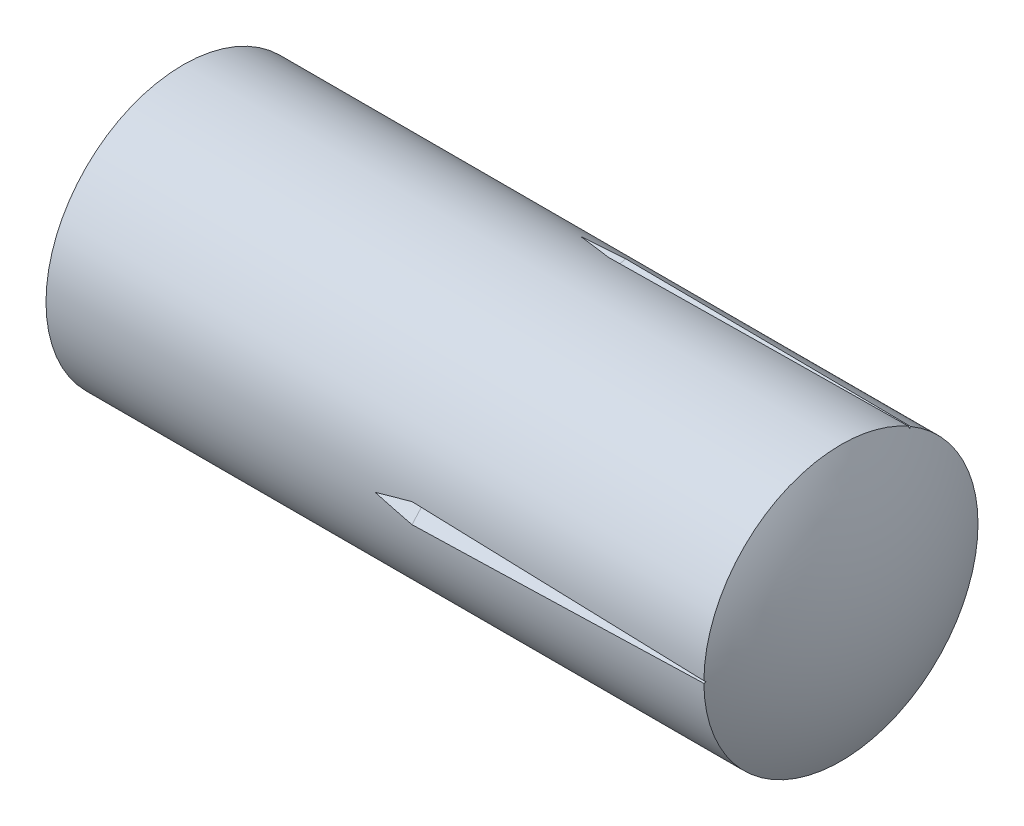
ISO-10303-21;
HEADER;
FILE_DESCRIPTION(('STEP AP214'),'2;1');
FILE_NAME('part.step','',(''),(''),'','','');
FILE_SCHEMA(('AUTOMOTIVE_DESIGN { 1 0 10303 214 1 1 1 1 }'));
ENDSEC;
DATA;
#1=APPLICATION_CONTEXT('core data for automotive mechanical design processes');
#2=APPLICATION_PROTOCOL_DEFINITION('international standard','automotive_design',2000,#1);
#3=PRODUCT_CONTEXT('',#1,'mechanical');
#4=PRODUCT('Part','Part','',(#3));
#5=PRODUCT_RELATED_PRODUCT_CATEGORY('part','',(#4));
#6=PRODUCT_DEFINITION_FORMATION('','',#4);
#7=PRODUCT_DEFINITION_CONTEXT('part definition',#1,'design');
#8=PRODUCT_DEFINITION('design','',#6,#7);
#9=PRODUCT_DEFINITION_SHAPE('','',#8);
#10=(LENGTH_UNIT() NAMED_UNIT(*) SI_UNIT(.MILLI.,.METRE.));
#11=(NAMED_UNIT(*) PLANE_ANGLE_UNIT() SI_UNIT($,.RADIAN.));
#12=(NAMED_UNIT(*) SI_UNIT($,.STERADIAN.) SOLID_ANGLE_UNIT());
#13=UNCERTAINTY_MEASURE_WITH_UNIT(LENGTH_MEASURE(1.E-05),#10,'distance_accuracy_value','');
#14=(GEOMETRIC_REPRESENTATION_CONTEXT(3) GLOBAL_UNCERTAINTY_ASSIGNED_CONTEXT((#13)) GLOBAL_UNIT_ASSIGNED_CONTEXT((#10,
#11,#12)) REPRESENTATION_CONTEXT('',''));
#15=CARTESIAN_POINT('',(0.,0.,0.));
#16=DIRECTION('',(0.,0.,1.));
#17=DIRECTION('',(1.,0.,0.));
#18=AXIS2_PLACEMENT_3D('',#15,#16,#17);
#19=CARTESIAN_POINT('',(-1.00375234668428,0.,0.));
#20=DIRECTION('',(-1.,0.,0.));
#21=DIRECTION('',(0.,1.,0.));
#22=AXIS2_PLACEMENT_3D('',#19,#20,#21);
#23=SPHERICAL_SURFACE('',#22,3.);
#24=CARTESIAN_POINT('',(-4.,0.,0.));
#25=DIRECTION('',(-1.,0.,0.));
#26=DIRECTION('',(0.,0.,1.));
#27=AXIS2_PLACEMENT_3D('',#24,#25,#26);
#28=CIRCLE('',#27,0.15);
#29=CARTESIAN_POINT('',(-4.,0.14999999999999,0.));
#30=VERTEX_POINT('',#29);
#31=EDGE_CURVE('E181',#30,#30,#28,.T.);
#32=CARTESIAN_POINT('',(-3.60182855803759,0.,0.));
#33=DIRECTION('',(-1.,0.,0.));
#34=DIRECTION('',(0.,0.,1.));
#35=AXIS2_PLACEMENT_3D('',#32,#33,#34);
#36=CIRCLE('',#35,1.5);
#37=CARTESIAN_POINT('',(-3.60182855803759,1.5,0.));
#38=VERTEX_POINT('',#37);
#39=EDGE_CURVE('E174',#38,#38,#36,.T.);
#40=CARTESIAN_POINT('',(-4.,0.14999999999999,0.));
#41=CARTESIAN_POINT('',(-3.99926004309734,0.164780799802356,0.));
#42=CARTESIAN_POINT('',(-3.99841069649623,0.179556123049043,0.));
#43=CARTESIAN_POINT('',(-3.99649344766886,0.209092582855593,0.));
#44=CARTESIAN_POINT('',(-3.99542554544259,0.223853719415457,0.));
#45=CARTESIAN_POINT('',(-3.9930714091366,0.2533585722729,0.));
#46=CARTESIAN_POINT('',(-3.99178517505689,0.268102288570479,0.));
#47=CARTESIAN_POINT('',(-3.98899465945976,0.297569071975744,0.));
#48=CARTESIAN_POINT('',(-3.98749037794234,0.312292139083429,0.));
#49=CARTESIAN_POINT('',(-3.98426409620463,0.341714399480714,0.));
#50=CARTESIAN_POINT('',(-3.98254209598433,0.356413592770312,0.));
#51=CARTESIAN_POINT('',(-3.97888075418033,0.385784886191741,0.));
#52=CARTESIAN_POINT('',(-3.97694141259664,0.400456986323571,0.));
#53=CARTESIAN_POINT('',(-3.97284581275971,0.429770880007589,0.));
#54=CARTESIAN_POINT('',(-3.97068955450648,0.444412673559776,0.));
#55=CARTESIAN_POINT('',(-3.96616059359861,0.473662747304538,0.));
#56=CARTESIAN_POINT('',(-3.96378789094397,0.488271027497112,0.));
#57=CARTESIAN_POINT('',(-3.95882656088838,0.517450875081477,0.));
#58=CARTESIAN_POINT('',(-3.95623793348743,0.532022442473267,0.));
#59=CARTESIAN_POINT('',(-3.95084532088995,0.561125673055873,0.));
#60=CARTESIAN_POINT('',(-3.94804133569342,0.57565733624669,0.));
#61=CARTESIAN_POINT('',(-3.94221862162095,0.604677575766722,0.));
#62=CARTESIAN_POINT('',(-3.93919989274501,0.619166152095937,0.));
#63=CARTESIAN_POINT('',(-3.93294835246243,0.64809704466885,0.));
#64=CARTESIAN_POINT('',(-3.9297155410558,0.662539360912549,0.));
#65=CARTESIAN_POINT('',(-3.92303654374789,0.69137457022219,0.));
#66=CARTESIAN_POINT('',(-3.9195903578466,0.705767463288133,0.));
#67=CARTESIAN_POINT('',(-3.91248536631779,0.734500673974471,0.));
#68=CARTESIAN_POINT('',(-3.90882656069026,0.748840991594867,0.));
#69=CARTESIAN_POINT('',(-3.90129713104437,0.777465910637157,0.));
#70=CARTESIAN_POINT('',(-3.89742650702601,0.791750512059052,0.));
#71=CARTESIAN_POINT('',(-3.88947428832544,0.820260870154107,0.));
#72=CARTESIAN_POINT('',(-3.88539269364322,0.834486626827267,0.));
#73=CARTESIAN_POINT('',(-3.87701942754774,0.862876179762533,0.));
#74=CARTESIAN_POINT('',(-3.87272775613448,0.877039976024639,0.));
#75=CARTESIAN_POINT('',(-3.86393527651979,0.905302506045771,0.));
#76=CARTESIAN_POINT('',(-3.85943446831838,0.919401239804798,0.));
#77=CARTESIAN_POINT('',(-3.8502247008745,0.947530556977452,0.));
#78=CARTESIAN_POINT('',(-3.84551574163204,0.961561140391078,0.));
#79=CARTESIAN_POINT('',(-3.83589070344151,0.989551083956596,0.));
#80=CARTESIAN_POINT('',(-3.83097462449344,1.00351044410849,0.));
#81=CARTESIAN_POINT('',(-3.82093642358955,1.0313548838332,0.));
#82=CARTESIAN_POINT('',(-3.81581430163374,1.04523996340602,0.));
#83=CARTESIAN_POINT('',(-3.80536513653888,1.07293280092388,0.));
#84=CARTESIAN_POINT('',(-3.80003809339984,1.08674055886892,0.));
#85=CARTESIAN_POINT('',(-3.7891802526439,1.11427572901708,0.));
#86=CARTESIAN_POINT('',(-3.783649455027,1.12800314122021,0.));
#87=CARTESIAN_POINT('',(-3.77238531664641,1.15537461336757,0.));
#88=CARTESIAN_POINT('',(-3.76665197588272,1.16901867331181,0.));
#89=CARTESIAN_POINT('',(-3.75498400689862,1.19622045267922,0.));
#90=CARTESIAN_POINT('',(-3.74904937867821,1.2097781721024,0.));
#91=CARTESIAN_POINT('',(-3.73698013455997,1.23680430107777,0.));
#92=CARTESIAN_POINT('',(-3.73084551866215,1.25027271062996,0.));
#93=CARTESIAN_POINT('',(-3.71837764275329,1.27711727006504,0.));
#94=CARTESIAN_POINT('',(-3.71204438274226,1.29049341994793,0.));
#95=CARTESIAN_POINT('',(-3.69918060573524,1.31715053048465,0.));
#96=CARTESIAN_POINT('',(-3.69265008873925,1.33043149113848,0.));
#97=CARTESIAN_POINT('',(-3.67939322787695,1.35689531438484,0.));
#98=CARTESIAN_POINT('',(-3.67266688401064,1.37007817697736,0.));
#99=CARTESIAN_POINT('',(-3.65901984321739,1.39634291720333,0.));
#100=CARTESIAN_POINT('',(-3.65209914629045,1.40942479483679,0.));
#101=CARTESIAN_POINT('',(-3.63806491274429,1.43548469868654,0.));
#102=CARTESIAN_POINT('',(-3.63095137612507,1.44846272490284,0.));
#103=CARTESIAN_POINT('',(-3.61653303002244,1.47431208846628,0.));
#104=CARTESIAN_POINT('',(-3.60922822053904,1.48718342581342,0.));
#105=CARTESIAN_POINT('',(-3.60182855803759,1.5,0.));
#106=B_SPLINE_CURVE_WITH_KNOTS('',3,(#40,#41,#42,#43,#44,#45,#46,#47,#48,#49,#50,#51,#52,#53,
#54,#55,#56,#57,#58,#59,#60,#61,#62,#63,#64,#65,#66,#67,#68,#69,#70,#71,#72,#73,#74,#75,#76,#77,
#78,#79,#80,#81,#82,#83,#84,#85,#86,#87,#88,#89,#90,#91,#92,#93,#94,#95,#96,#97,#98,#99,#100,
#101,#102,#103,#104,#105),.UNSPECIFIED.,.F.,.F.,(4,2,2,2,2,2,2,2,2,2,2,2,2,2,2,2,2,2,2,2,2,2,2,
2,2,2,2,2,2,2,2,2,4),(0.,0.0443975247205865,0.0887950494411723,0.133192574161759,
0.177590098882345,0.221987623602931,0.266385148323518,0.310782673044104,0.355180197764691,
0.399577722485276,0.443975247205863,0.488372771926449,0.532770296647035,0.577167821367622,
0.621565346088208,0.665962870808794,0.710360395529381,0.754757920249967,0.799155444970553,
0.843552969691139,0.887950494411726,0.932348019132312,0.976745543852898,1.02114306857349,
1.06554059329407,1.10993811801466,1.15433564273524,1.19873316745583,1.24313069217642,
1.287528216897,1.33192574161759,1.37632326633817,1.42072079105876),.UNSPECIFIED.);
#107=EDGE_CURVE('BSEAM36',#30,#38,#106,.T.);
#108=ORIENTED_EDGE('',*,*,#31,.F.);
#109=ORIENTED_EDGE('',*,*,#39,.T.);
#110=ORIENTED_EDGE('',*,*,#107,.T.);
#111=ORIENTED_EDGE('',*,*,#107,.F.);
#112=EDGE_LOOP('',(#108,#110,#109,#111));
#113=FACE_BOUND('',#112,.T.);
#114=ADVANCED_FACE('F36',(#113),#23,.T.);
#115=CARTESIAN_POINT('',(-4.,0.,0.));
#116=DIRECTION('',(1.,0.,0.));
#117=DIRECTION('',(0.,0.,-1.));
#118=AXIS2_PLACEMENT_3D('',#115,#116,#117);
#119=PLANE('',#118);
#120=ORIENTED_EDGE('',*,*,#31,.T.);
#121=EDGE_LOOP('',(#120));
#122=FACE_BOUND('',#121,.T.);
#123=ADVANCED_FACE('F238',(#122),#119,.F.);
#124=CARTESIAN_POINT('',(1.,0.,0.));
#125=DIRECTION('',(-1.,0.,0.));
#126=DIRECTION('',(0.,1.,0.));
#127=AXIS2_PLACEMENT_3D('',#124,#125,#126);
#128=SPHERICAL_SURFACE('',#127,3.);
#129=CARTESIAN_POINT('',(3.59807621135332,0.,0.));
#130=DIRECTION('',(-1.,0.,0.));
#131=DIRECTION('',(0.,0.,1.));
#132=AXIS2_PLACEMENT_3D('',#129,#130,#131);
#133=CIRCLE('',#132,1.5);
#134=CARTESIAN_POINT('',(3.59807621135332,1.29274678450239,-0.760792843787808));
#135=VERTEX_POINT('',#134);
#136=CARTESIAN_POINT('',(3.59807621135332,-1.29274678450238,-0.760792843787826));
#137=VERTEX_POINT('',#136);
#138=EDGE_CURVE('E182',#135,#137,#133,.T.);
#139=ORIENTED_EDGE('',*,*,#138,.F.);
#140=CARTESIAN_POINT('',(0.979394813486616,0.761674520247746,0.32334161975266));
#141=DIRECTION('',(0.0248938718873842,-0.920206566177524,-0.39064071818773));
#142=DIRECTION('',(0.,0.390761815449366,-0.920491827007017));
#143=AXIS2_PLACEMENT_3D('',#140,#141,#142);
#144=CIRCLE('',#143,2.88355293837825);
#145=CARTESIAN_POINT('',(3.60738836081423,1.28496865795157,-0.741877000568558));
#146=VERTEX_POINT('',#145);
#147=EDGE_CURVE('E141',#135,#146,#144,.T.);
#148=ORIENTED_EDGE('',*,*,#147,.T.);
#149=CARTESIAN_POINT('',(0.979394813486616,0.100815203317277,-0.821300293826201));
#150=DIRECTION('',(0.0248938718873843,-0.121798497385609,0.992242622132844));
#151=DIRECTION('',(0.,-0.992550213888708,-0.12183625449545));
#152=AXIS2_PLACEMENT_3D('',#149,#150,#151);
#153=CIRCLE('',#152,2.88355293837825);
#154=CARTESIAN_POINT('',(3.59807621135332,1.30523932198886,-0.739155134145787));
#155=VERTEX_POINT('',#154);
#156=EDGE_CURVE('E127',#146,#155,#153,.T.);
#157=ORIENTED_EDGE('',*,*,#156,.T.);
#158=CARTESIAN_POINT('',(3.59807621135331,0.0124925374864668,1.49994797793362));
#159=VERTEX_POINT('',#158);
#160=EDGE_CURVE('E178',#159,#155,#133,.T.);
#161=ORIENTED_EDGE('',*,*,#160,.F.);
#162=CARTESIAN_POINT('',(0.979394813486616,-0.66085931693048,0.497958674073549));
#163=DIRECTION('',(0.0248938718873843,0.798408068791928,-0.601601903945124));
#164=DIRECTION('',(0.,0.601788398439352,0.79865557251158));
#165=AXIS2_PLACEMENT_3D('',#162,#163,#164);
#166=CIRCLE('',#165,2.88355293837825);
#167=CARTESIAN_POINT('',(3.60738836081423,0.,1.48375400113714));
#168=VERTEX_POINT('',#167);
#169=EDGE_CURVE('E171',#159,#168,#166,.T.);
#170=ORIENTED_EDGE('',*,*,#169,.T.);
#171=CARTESIAN_POINT('',(0.979394813486616,0.66085931693048,0.49795867407355));
#172=DIRECTION('',(0.0248938718873843,-0.798408068791927,-0.601601903945125));
#173=DIRECTION('',(0.,0.601788398439352,-0.79865557251158));
#174=AXIS2_PLACEMENT_3D('',#171,#172,#173);
#175=CIRCLE('',#174,2.88355293837825);
#176=CARTESIAN_POINT('',(3.59807621135332,-0.0124925374864675,1.49994797793362));
#177=VERTEX_POINT('',#176);
#178=EDGE_CURVE('E168',#168,#177,#175,.T.);
#179=ORIENTED_EDGE('',*,*,#178,.T.);
#180=CARTESIAN_POINT('',(3.59807621135332,-1.30523932198885,-0.739155134145806));
#181=VERTEX_POINT('',#180);
#182=EDGE_CURVE('E177',#181,#177,#133,.T.);
#183=ORIENTED_EDGE('',*,*,#182,.F.);
#184=CARTESIAN_POINT('',(0.979394813486616,-0.100815203317265,-0.821300293826203));
#185=DIRECTION('',(0.0248938718873843,0.121798497385595,0.992242622132846));
#186=DIRECTION('',(0.,-0.99255021388871,0.121836254495436));
#187=AXIS2_PLACEMENT_3D('',#184,#185,#186);
#188=CIRCLE('',#187,2.88355293837825);
#189=CARTESIAN_POINT('',(3.60738836081423,-1.28496865795157,-0.741877000568577));
#190=VERTEX_POINT('',#189);
#191=EDGE_CURVE('E155',#181,#190,#188,.T.);
#192=ORIENTED_EDGE('',*,*,#191,.T.);
#193=CARTESIAN_POINT('',(0.979394813486616,-0.761674520247751,0.323341619752649));
#194=DIRECTION('',(0.0248938718873843,0.920206566177529,-0.390640718187716));
#195=DIRECTION('',(0.,0.390761815449352,0.920491827007022));
#196=AXIS2_PLACEMENT_3D('',#193,#194,#195);
#197=CIRCLE('',#196,2.88355293837825);
#198=EDGE_CURVE('E152',#190,#137,#197,.T.);
#199=ORIENTED_EDGE('',*,*,#198,.T.);
#200=EDGE_LOOP('',(#139,#148,#157,#161,#170,#179,#183,#192,#199));
#201=FACE_BOUND('',#200,.T.);
#202=ADVANCED_FACE('F212',(#201),#128,.T.);
#203=CARTESIAN_POINT('',(-57.,0.,0.));
#204=DIRECTION('',(-1.,0.,0.));
#205=DIRECTION('',(0.,0.,1.));
#206=AXIS2_PLACEMENT_3D('',#203,#204,#205);
#207=CYLINDRICAL_SURFACE('',#206,1.5);
#208=ORIENTED_EDGE('',*,*,#39,.F.);
#209=EDGE_LOOP('',(#208));
#210=FACE_BOUND('',#209,.T.);
#211=CARTESIAN_POINT('',(3.75000000000002,0.,0.));
#212=DIRECTION('',(0.223620539334225,0.883356704074503,0.411915995992508));
#213=DIRECTION('',(-0.974676281843295,0.202669036139943,0.0945061236229497));
#214=AXIS2_PLACEMENT_3D('',#211,#212,#213);
#215=ELLIPSE('',#214,6.70779171030478,1.5);
#216=CARTESIAN_POINT('',(0.400000915509019,1.24096625628753,-0.842616609589266));
#217=VERTEX_POINT('',#216);
#218=CARTESIAN_POINT('',(0.,1.29903810567667,-0.74999999999999));
#219=VERTEX_POINT('',#218);
#220=EDGE_CURVE('E137',#217,#219,#215,.T.);
#221=ORIENTED_EDGE('',*,*,#220,.F.);
#222=CARTESIAN_POINT('',(-32.2500000000003,0.,0.));
#223=DIRECTION('',(0.0248938718873842,-0.920206566177524,-0.39064071818773));
#224=DIRECTION('',(-0.999690099552083,-0.0229146056148969,-0.0097275745722782));
#225=AXIS2_PLACEMENT_3D('',#222,#223,#224);
#226=ELLIPSE('',#225,60.2557933448744,1.5);
#227=EDGE_CURVE('E12',#217,#135,#226,.T.);
#228=ORIENTED_EDGE('',*,*,#227,.T.);
#229=ORIENTED_EDGE('',*,*,#138,.T.);
#230=CARTESIAN_POINT('',(-32.2500000000002,0.,0.));
#231=DIRECTION('',(0.0248938718873843,0.920206566177529,-0.390640718187716));
#232=DIRECTION('',(-0.999690099552084,0.0229146056148972,-0.00972757457227791));
#233=AXIS2_PLACEMENT_3D('',#230,#231,#232);
#234=ELLIPSE('',#233,60.2557933448741,1.5);
#235=CARTESIAN_POINT('',(0.400000915509019,-1.24096625628752,-0.842616609589282));
#236=VERTEX_POINT('',#235);
#237=EDGE_CURVE('E200',#137,#236,#234,.T.);
#238=ORIENTED_EDGE('',*,*,#237,.T.);
#239=CARTESIAN_POINT('',(3.75000000000001,0.,0.));
#240=DIRECTION('',(0.223620539334226,-0.883356704074509,0.411915995992496));
#241=DIRECTION('',(-0.974676281843295,-0.202669036139945,0.0945061236229471));
#242=AXIS2_PLACEMENT_3D('',#239,#240,#241);
#243=ELLIPSE('',#242,6.70779171030475,1.5);
#244=CARTESIAN_POINT('',(0.,-1.29903810567666,-0.750000000000006));
#245=VERTEX_POINT('',#244);
#246=EDGE_CURVE('E196',#245,#236,#243,.T.);
#247=ORIENTED_EDGE('',*,*,#246,.F.);
#248=CARTESIAN_POINT('',(3.75000000000002,0.,0.));
#249=DIRECTION('',(0.223620539334226,-0.0849486352825749,-0.970967344328066));
#250=DIRECTION('',(-0.974676281843295,-0.0194898141993056,-0.222769595669173));
#251=AXIS2_PLACEMENT_3D('',#248,#249,#250);
#252=ELLIPSE('',#251,6.70779171030476,1.5);
#253=CARTESIAN_POINT('',(0.400000915509018,-1.35021051769879,-0.653399998389635));
#254=VERTEX_POINT('',#253);
#255=EDGE_CURVE('E198',#254,#245,#252,.T.);
#256=ORIENTED_EDGE('',*,*,#255,.F.);
#257=CARTESIAN_POINT('',(-32.2500000000002,0.,0.));
#258=DIRECTION('',(0.0248938718873843,0.121798497385595,0.992242622132846));
#259=DIRECTION('',(-0.999690099552083,0.00303297611064813,0.0247084178663414));
#260=AXIS2_PLACEMENT_3D('',#257,#258,#259);
#261=ELLIPSE('',#260,60.2557933448742,1.5);
#262=EDGE_CURVE('E203',#254,#181,#261,.T.);
#263=ORIENTED_EDGE('',*,*,#262,.T.);
#264=ORIENTED_EDGE('',*,*,#182,.T.);
#265=CARTESIAN_POINT('',(-32.2500000000003,0.,0.));
#266=DIRECTION('',(0.0248938718873843,-0.798408068791927,-0.601601903945125));
#267=DIRECTION('',(-0.999690099552083,-0.0198816295042488,-0.0149808432940634));
#268=AXIS2_PLACEMENT_3D('',#265,#266,#267);
#269=ELLIPSE('',#268,60.2557933448742,1.5);
#270=CARTESIAN_POINT('',(0.400000915509019,-0.109244261411265,1.4960166079789));
#271=VERTEX_POINT('',#270);
#272=EDGE_CURVE('E190',#177,#271,#269,.T.);
#273=ORIENTED_EDGE('',*,*,#272,.T.);
#274=CARTESIAN_POINT('',(3.75000000000002,0.,0.));
#275=DIRECTION('',(0.223620539334226,0.798408068791927,0.559051348335566));
#276=DIRECTION('',(-0.974676281843295,0.183179221940638,0.128263472046225));
#277=AXIS2_PLACEMENT_3D('',#274,#275,#276);
#278=ELLIPSE('',#277,6.70779171030476,1.5);
#279=CARTESIAN_POINT('',(0.,0.,1.5));
#280=VERTEX_POINT('',#279);
#281=EDGE_CURVE('E185',#280,#271,#278,.T.);
#282=ORIENTED_EDGE('',*,*,#281,.F.);
#283=CARTESIAN_POINT('',(3.75000000000001,0.,0.));
#284=DIRECTION('',(0.223620539334226,-0.798408068791928,0.559051348335566));
#285=DIRECTION('',(-0.974676281843295,-0.183179221940638,0.128263472046224));
#286=AXIS2_PLACEMENT_3D('',#283,#284,#285);
#287=ELLIPSE('',#286,6.70779171030477,1.5);
#288=CARTESIAN_POINT('',(0.400000915509019,0.109244261411266,1.49601660797891));
#289=VERTEX_POINT('',#288);
#290=EDGE_CURVE('E187',#289,#280,#287,.T.);
#291=ORIENTED_EDGE('',*,*,#290,.F.);
#292=CARTESIAN_POINT('',(-32.2500000000003,0.,0.));
#293=DIRECTION('',(0.0248938718873843,0.798408068791928,-0.601601903945124));
#294=DIRECTION('',(-0.999690099552083,0.0198816295042488,-0.0149808432940634));
#295=AXIS2_PLACEMENT_3D('',#292,#293,#294);
#296=ELLIPSE('',#295,60.2557933448743,1.5);
#297=EDGE_CURVE('E193',#289,#159,#296,.T.);
#298=ORIENTED_EDGE('',*,*,#297,.T.);
#299=ORIENTED_EDGE('',*,*,#160,.T.);
#300=CARTESIAN_POINT('',(-32.2500000000002,0.,0.));
#301=DIRECTION('',(0.0248938718873843,-0.121798497385609,0.992242622132844));
#302=DIRECTION('',(-0.999690099552084,-0.00303297611064848,0.0247084178663414));
#303=AXIS2_PLACEMENT_3D('',#300,#301,#302);
#304=ELLIPSE('',#303,60.2557933448742,1.5);
#305=CARTESIAN_POINT('',(0.400000915509019,1.3502105176988,-0.653399998389616));
#306=VERTEX_POINT('',#305);
#307=EDGE_CURVE('E43',#155,#306,#304,.T.);
#308=ORIENTED_EDGE('',*,*,#307,.T.);
#309=CARTESIAN_POINT('',(3.75000000000002,0.,0.));
#310=DIRECTION('',(0.223620539334226,0.084948635282589,-0.970967344328065));
#311=DIRECTION('',(-0.974676281843295,0.0194898141993089,-0.222769595669172));
#312=AXIS2_PLACEMENT_3D('',#309,#310,#311);
#313=ELLIPSE('',#312,6.70779171030476,1.5);
#314=EDGE_CURVE('E117',#219,#306,#313,.T.);
#315=ORIENTED_EDGE('',*,*,#314,.F.);
#316=EDGE_LOOP('',(#221,#228,#229,#238,#247,#256,#263,#264,#273,#282,#291,#298,#299,#308,#315));
#317=FACE_BOUND('',#316,.T.);
#318=ADVANCED_FACE('F208',(#210,#317),#207,.T.);
#319=CARTESIAN_POINT('',(0.297310566337695,-0.339472560388261,0.896258713002786));
#320=DIRECTION('',(0.0248938718873843,0.798408068791928,-0.601601903945124));
#321=DIRECTION('',(0.,0.601788398439352,0.79865557251158));
#322=AXIS2_PLACEMENT_3D('',#319,#320,#321);
#323=PLANE('',#322);
#324=ORIENTED_EDGE('',*,*,#297,.F.);
#325=DIRECTION('',(0.135825997320614,0.593506695880205,0.793285005781165));
#326=VECTOR('',#325,1.);
#327=CARTESIAN_POINT('',(0.297310566337695,-0.339472560388261,0.896258713002786));
#328=LINE('',#327,#326);
#329=CARTESIAN_POINT('',(0.374999999999998,0.,1.35));
#330=VERTEX_POINT('',#329);
#331=EDGE_CURVE('E159',#330,#289,#328,.T.);
#332=ORIENTED_EDGE('',*,*,#331,.F.);
#333=DIRECTION('',(0.999144974192893,0.,0.0413439299666022));
#334=VECTOR('',#333,1.);
#335=CARTESIAN_POINT('',(0.374999999999998,0.,1.35));
#336=LINE('',#335,#334);
#337=EDGE_CURVE('E165',#330,#168,#336,.T.);
#338=ORIENTED_EDGE('',*,*,#337,.T.);
#339=ORIENTED_EDGE('',*,*,#169,.F.);
#340=EDGE_LOOP('',(#324,#332,#338,#339));
#341=FACE_BOUND('',#340,.T.);
#342=ADVANCED_FACE('F249',(#341),#323,.F.);
#343=CARTESIAN_POINT('',(0.297310566337695,0.339472560388261,0.896258713002787));
#344=DIRECTION('',(0.0248938718873843,-0.798408068791927,-0.601601903945125));
#345=DIRECTION('',(0.,0.601788398439352,-0.79865557251158));
#346=AXIS2_PLACEMENT_3D('',#343,#344,#345);
#347=PLANE('',#346);
#348=ORIENTED_EDGE('',*,*,#337,.F.);
#349=DIRECTION('',(-0.135825997320614,0.593506695880205,-0.793285005781164));
#350=VECTOR('',#349,1.);
#351=CARTESIAN_POINT('',(0.297310566337695,0.339472560388261,0.896258713002787));
#352=LINE('',#351,#350);
#353=EDGE_CURVE('E162',#271,#330,#352,.T.);
#354=ORIENTED_EDGE('',*,*,#353,.F.);
#355=ORIENTED_EDGE('',*,*,#272,.F.);
#356=ORIENTED_EDGE('',*,*,#178,.F.);
#357=EDGE_LOOP('',(#348,#354,#355,#356));
#358=FACE_BOUND('',#357,.T.);
#359=ADVANCED_FACE('F255',(#358),#347,.F.);
#360=CARTESIAN_POINT('',(3.52660025022539,0.,0.0893598999098467));
#361=DIRECTION('',(0.223620539334226,-0.798408068791928,0.559051348335566));
#362=DIRECTION('',(0.,-0.573576436351047,-0.819152044288991));
#363=AXIS2_PLACEMENT_3D('',#360,#361,#362);
#364=PLANE('',#363);
#365=ORIENTED_EDGE('',*,*,#290,.T.);
#366=DIRECTION('',(-0.92847669088526,0.,0.371390676354103));
#367=VECTOR('',#366,1.);
#368=CARTESIAN_POINT('',(3.52660025022539,0.,0.0893598999098467));
#369=LINE('',#368,#367);
#370=EDGE_CURVE('E158',#330,#280,#369,.T.);
#371=ORIENTED_EDGE('',*,*,#370,.F.);
#372=ORIENTED_EDGE('',*,*,#331,.T.);
#373=EDGE_LOOP('',(#365,#371,#372));
#374=FACE_BOUND('',#373,.T.);
#375=ADVANCED_FACE('F261',(#374),#364,.T.);
#376=CARTESIAN_POINT('',(3.52660025022539,0.,0.0893598999098467));
#377=DIRECTION('',(0.223620539334226,0.798408068791927,0.559051348335566));
#378=DIRECTION('',(0.,-0.573576436351048,0.819152044288991));
#379=AXIS2_PLACEMENT_3D('',#376,#377,#378);
#380=PLANE('',#379);
#381=ORIENTED_EDGE('',*,*,#281,.T.);
#382=ORIENTED_EDGE('',*,*,#353,.T.);
#383=ORIENTED_EDGE('',*,*,#370,.T.);
#384=EDGE_LOOP('',(#381,#382,#383));
#385=FACE_BOUND('',#384,.T.);
#386=ADVANCED_FACE('F264',(#385),#380,.T.);
#387=CARTESIAN_POINT('',(0.295399794375736,-0.5926072256658,-0.743772064328992));
#388=DIRECTION('',(0.0248938718873843,0.121798497385595,0.992242622132846));
#389=DIRECTION('',(0.,-0.99255021388871,0.121836254495436));
#390=AXIS2_PLACEMENT_3D('',#387,#388,#389);
#391=PLANE('',#390);
#392=ORIENTED_EDGE('',*,*,#262,.F.);
#393=DIRECTION('',(0.135825997320614,-0.983758315387877,0.117349373057835));
#394=VECTOR('',#393,1.);
#395=CARTESIAN_POINT('',(0.295399794375736,-0.5926072256658,-0.743772064328992));
#396=LINE('',#395,#394);
#397=CARTESIAN_POINT('',(0.374999999999998,-1.16913429510899,-0.675000000000006));
#398=VERTEX_POINT('',#397);
#399=EDGE_CURVE('E143',#398,#254,#396,.T.);
#400=ORIENTED_EDGE('',*,*,#399,.F.);
#401=DIRECTION('',(0.999144974192893,-0.0358048936433622,-0.0206719649833013));
#402=VECTOR('',#401,1.);
#403=CARTESIAN_POINT('',(0.374999999999998,-1.16913429510899,-0.675000000000006));
#404=LINE('',#403,#402);
#405=EDGE_CURVE('E149',#398,#190,#404,.T.);
#406=ORIENTED_EDGE('',*,*,#405,.T.);
#407=ORIENTED_EDGE('',*,*,#191,.F.);
#408=EDGE_LOOP('',(#392,#400,#406,#407));
#409=FACE_BOUND('',#408,.T.);
#410=ADVANCED_FACE('F221',(#409),#391,.F.);
#411=CARTESIAN_POINT('',(0.295399794375737,-0.940429115166999,-0.141326879728315));
#412=DIRECTION('',(0.0248938718873843,0.920206566177529,-0.390640718187716));
#413=DIRECTION('',(0.,0.390761815449352,0.920491827007022));
#414=AXIS2_PLACEMENT_3D('',#411,#412,#413);
#415=PLANE('',#414);
#416=ORIENTED_EDGE('',*,*,#405,.F.);
#417=DIRECTION('',(-0.135825997320614,0.390251619507667,0.910634378839007));
#418=VECTOR('',#417,1.);
#419=CARTESIAN_POINT('',(0.295399794375737,-0.940429115166999,-0.141326879728315));
#420=LINE('',#419,#418);
#421=EDGE_CURVE('E146',#236,#398,#420,.T.);
#422=ORIENTED_EDGE('',*,*,#421,.F.);
#423=ORIENTED_EDGE('',*,*,#237,.F.);
#424=ORIENTED_EDGE('',*,*,#198,.F.);
#425=EDGE_LOOP('',(#416,#422,#423,#424));
#426=FACE_BOUND('',#425,.T.);
#427=ADVANCED_FACE('F218',(#426),#415,.F.);
#428=CARTESIAN_POINT('',(3.60411387221428,-0.0505364370888706,-0.029177225557145));
#429=DIRECTION('',(0.223620539334226,-0.0849486352825749,-0.970967344328066));
#430=DIRECTION('',(-0.974489801655933,0.,-0.224431785780402));
#431=AXIS2_PLACEMENT_3D('',#428,#429,#430);
#432=PLANE('',#431);
#433=ORIENTED_EDGE('',*,*,#255,.T.);
#434=DIRECTION('',(-0.928476690885259,-0.321633760451337,-0.185695338177053));
#435=VECTOR('',#434,1.);
#436=CARTESIAN_POINT('',(3.60411387221428,-0.0505364370888706,-0.029177225557145));
#437=LINE('',#436,#435);
#438=EDGE_CURVE('E58',#398,#245,#437,.T.);
#439=ORIENTED_EDGE('',*,*,#438,.F.);
#440=ORIENTED_EDGE('',*,*,#399,.T.);
#441=EDGE_LOOP('',(#433,#439,#440));
#442=FACE_BOUND('',#441,.T.);
#443=ADVANCED_FACE('F226',(#442),#432,.T.);
#444=CARTESIAN_POINT('',(3.60411387221428,-0.0505364370888706,-0.029177225557145));
#445=DIRECTION('',(0.223620539334226,-0.883356704074509,0.411915995992496));
#446=DIRECTION('',(0.,-0.422618261740694,-0.906307787036653));
#447=AXIS2_PLACEMENT_3D('',#444,#445,#446);
#448=PLANE('',#447);
#449=ORIENTED_EDGE('',*,*,#246,.T.);
#450=ORIENTED_EDGE('',*,*,#421,.T.);
#451=ORIENTED_EDGE('',*,*,#438,.T.);
#452=EDGE_LOOP('',(#449,#450,#451));
#453=FACE_BOUND('',#452,.T.);
#454=ADVANCED_FACE('F228',(#453),#448,.T.);
#455=CARTESIAN_POINT('',(0.295399794375737,0.940429115167001,-0.141326879728301));
#456=DIRECTION('',(0.0248938718873842,-0.920206566177524,-0.39064071818773));
#457=DIRECTION('',(0.,0.390761815449366,-0.920491827007017));
#458=AXIS2_PLACEMENT_3D('',#455,#456,#457);
#459=PLANE('',#458);
#460=ORIENTED_EDGE('',*,*,#227,.F.);
#461=DIRECTION('',(0.135825997320614,0.39025161950768,-0.910634378839001));
#462=VECTOR('',#461,1.);
#463=CARTESIAN_POINT('',(0.295399794375737,0.940429115167001,-0.141326879728301));
#464=LINE('',#463,#462);
#465=CARTESIAN_POINT('',(0.374999999999998,1.169134295109,-0.674999999999989));
#466=VERTEX_POINT('',#465);
#467=EDGE_CURVE('E121',#466,#217,#464,.T.);
#468=ORIENTED_EDGE('',*,*,#467,.F.);
#469=DIRECTION('',(0.999144974192893,0.0358048936433623,-0.0206719649833008));
#470=VECTOR('',#469,1.);
#471=CARTESIAN_POINT('',(0.374999999999998,1.169134295109,-0.674999999999989));
#472=LINE('',#471,#470);
#473=EDGE_CURVE('E120',#466,#146,#472,.T.);
#474=ORIENTED_EDGE('',*,*,#473,.T.);
#475=ORIENTED_EDGE('',*,*,#147,.F.);
#476=EDGE_LOOP('',(#460,#468,#474,#475));
#477=FACE_BOUND('',#476,.T.);
#478=ADVANCED_FACE('F132',(#477),#459,.F.);
#479=CARTESIAN_POINT('',(0.295399794375737,0.592607225665812,-0.743772064328983));
#480=DIRECTION('',(0.0248938718873843,-0.121798497385609,0.992242622132844));
#481=DIRECTION('',(0.,-0.992550213888708,-0.12183625449545));
#482=AXIS2_PLACEMENT_3D('',#479,#480,#481);
#483=PLANE('',#482);
#484=ORIENTED_EDGE('',*,*,#473,.F.);
#485=DIRECTION('',(-0.135825997320614,-0.983758315387875,-0.11734937305785));
#486=VECTOR('',#485,1.);
#487=CARTESIAN_POINT('',(0.295399794375737,0.592607225665812,-0.743772064328983));
#488=LINE('',#487,#486);
#489=EDGE_CURVE('E113',#306,#466,#488,.T.);
#490=ORIENTED_EDGE('',*,*,#489,.F.);
#491=ORIENTED_EDGE('',*,*,#307,.F.);
#492=ORIENTED_EDGE('',*,*,#156,.F.);
#493=EDGE_LOOP('',(#484,#490,#491,#492));
#494=FACE_BOUND('',#493,.T.);
#495=ADVANCED_FACE('F125',(#494),#483,.F.);
#496=CARTESIAN_POINT('',(3.60411387221429,0.0505364370888713,-0.0291772255571425));
#497=DIRECTION('',(0.223620539334225,0.883356704074503,0.411915995992508));
#498=DIRECTION('',(0.,-0.422618261740707,0.906307787036646));
#499=AXIS2_PLACEMENT_3D('',#496,#497,#498);
#500=PLANE('',#499);
#501=ORIENTED_EDGE('',*,*,#220,.T.);
#502=DIRECTION('',(-0.92847669088526,0.321633760451339,-0.185695338177049));
#503=VECTOR('',#502,1.);
#504=CARTESIAN_POINT('',(3.60411387221429,0.0505364370888713,-0.0291772255571425));
#505=LINE('',#504,#503);
#506=EDGE_CURVE('E50',#466,#219,#505,.T.);
#507=ORIENTED_EDGE('',*,*,#506,.F.);
#508=ORIENTED_EDGE('',*,*,#467,.T.);
#509=EDGE_LOOP('',(#501,#507,#508));
#510=FACE_BOUND('',#509,.T.);
#511=ADVANCED_FACE('F136',(#510),#500,.T.);
#512=CARTESIAN_POINT('',(3.60411387221429,0.0505364370888713,-0.0291772255571425));
#513=DIRECTION('',(0.223620539334226,0.084948635282589,-0.970967344328065));
#514=DIRECTION('',(-0.974489801655933,0.,-0.224431785780403));
#515=AXIS2_PLACEMENT_3D('',#512,#513,#514);
#516=PLANE('',#515);
#517=ORIENTED_EDGE('',*,*,#314,.T.);
#518=ORIENTED_EDGE('',*,*,#489,.T.);
#519=ORIENTED_EDGE('',*,*,#506,.T.);
#520=EDGE_LOOP('',(#517,#518,#519));
#521=FACE_BOUND('',#520,.T.);
#522=ADVANCED_FACE('F115',(#521),#516,.T.);
#523=CLOSED_SHELL('',(#114,#123,#202,#318,#342,#359,#375,#386,#410,#427,#443,#454,#478,#495,
#511,#522));
#524=MANIFOLD_SOLID_BREP('B2',#523);
#525=ADVANCED_BREP_SHAPE_REPRESENTATION('',(#18,#524),#14);
#526=SHAPE_DEFINITION_REPRESENTATION(#9,#525);
ENDSEC;
END-ISO-10303-21;
